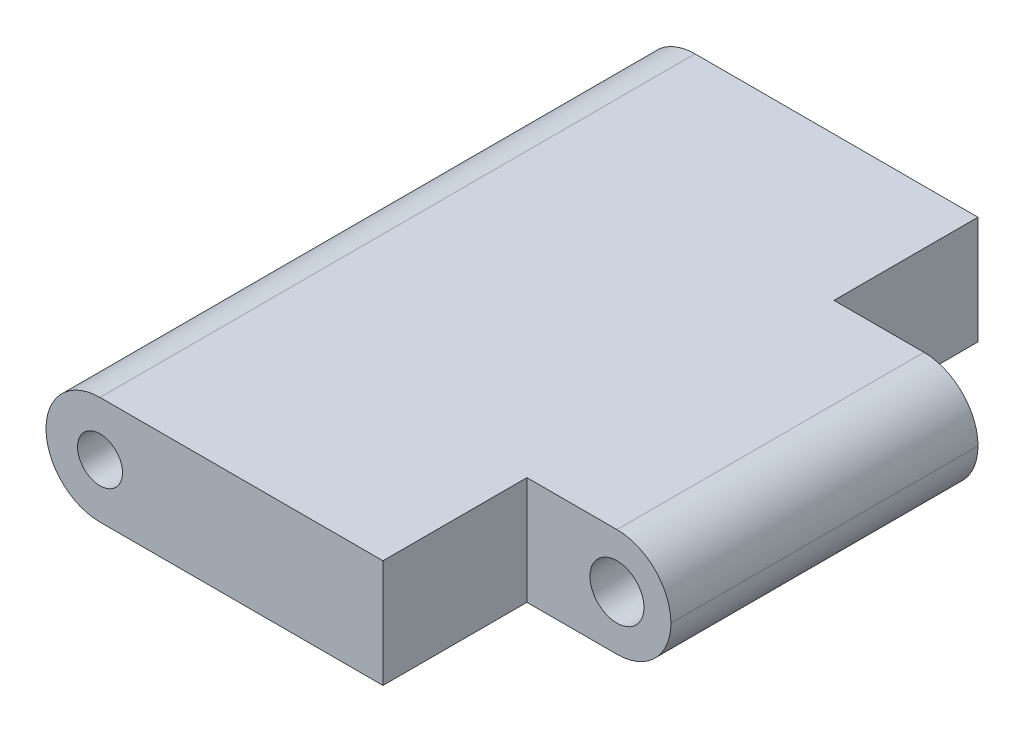
ISO-10303-21;
HEADER;
FILE_DESCRIPTION(('STEP AP214'),'2;1');
FILE_NAME('part.step','',(''),(''),'','','');
FILE_SCHEMA(('AUTOMOTIVE_DESIGN { 1 0 10303 214 1 1 1 1 }'));
ENDSEC;
DATA;
#1=APPLICATION_CONTEXT('core data for automotive mechanical design processes');
#2=APPLICATION_PROTOCOL_DEFINITION('international standard','automotive_design',2000,#1);
#3=PRODUCT_CONTEXT('',#1,'mechanical');
#4=PRODUCT('Part','Part','',(#3));
#5=PRODUCT_RELATED_PRODUCT_CATEGORY('part','',(#4));
#6=PRODUCT_DEFINITION_FORMATION('','',#4);
#7=PRODUCT_DEFINITION_CONTEXT('part definition',#1,'design');
#8=PRODUCT_DEFINITION('design','',#6,#7);
#9=PRODUCT_DEFINITION_SHAPE('','',#8);
#10=(LENGTH_UNIT() NAMED_UNIT(*) SI_UNIT(.MILLI.,.METRE.));
#11=(NAMED_UNIT(*) PLANE_ANGLE_UNIT() SI_UNIT($,.RADIAN.));
#12=(NAMED_UNIT(*) SI_UNIT($,.STERADIAN.) SOLID_ANGLE_UNIT());
#13=UNCERTAINTY_MEASURE_WITH_UNIT(LENGTH_MEASURE(1.E-05),#10,'distance_accuracy_value','');
#14=(GEOMETRIC_REPRESENTATION_CONTEXT(3) GLOBAL_UNCERTAINTY_ASSIGNED_CONTEXT((#13)) GLOBAL_UNIT_ASSIGNED_CONTEXT((#10,
#11,#12)) REPRESENTATION_CONTEXT('',''));
#15=CARTESIAN_POINT('',(0.,0.,0.));
#16=DIRECTION('',(0.,0.,1.));
#17=DIRECTION('',(1.,0.,0.));
#18=AXIS2_PLACEMENT_3D('',#15,#16,#17);
#19=CARTESIAN_POINT('',(15.5838095287745,3.45,2.47935041886915));
#20=DIRECTION('',(0.,0.,-1.));
#21=DIRECTION('',(-1.,0.,0.));
#22=AXIS2_PLACEMENT_3D('',#19,#20,#21);
#23=PLANE('',#22);
#24=CARTESIAN_POINT('',(0.16703536190109,1.5,2.47935041886915));
#25=DIRECTION('',(0.,0.,1.));
#26=DIRECTION('',(1.,0.,0.));
#27=AXIS2_PLACEMENT_3D('',#24,#25,#26);
#28=CIRCLE('',#27,0.8125);
#29=CARTESIAN_POINT('',(0.97953536190109,1.5,2.47935041886915));
#30=VERTEX_POINT('',#29);
#31=EDGE_CURVE('E210',#30,#30,#28,.T.);
#32=ORIENTED_EDGE('',*,*,#31,.F.);
#33=EDGE_LOOP('',(#32));
#34=FACE_BOUND('',#33,.T.);
#35=CARTESIAN_POINT('',(0.167035361901083,1.5,2.47935041886915));
#36=DIRECTION('',(0.,0.,-1.));
#37=DIRECTION('',(-1.,0.,0.));
#38=AXIS2_PLACEMENT_3D('',#35,#36,#37);
#39=CIRCLE('',#38,1.95);
#40=CARTESIAN_POINT('',(0.167035361901083,3.45,2.47935041886915));
#41=VERTEX_POINT('',#40);
#42=CARTESIAN_POINT('',(-1.78296463809892,1.5,2.47935041886915));
#43=VERTEX_POINT('',#42);
#44=EDGE_CURVE('E160',#41,#43,#39,.F.);
#45=ORIENTED_EDGE('',*,*,#44,.T.);
#46=CARTESIAN_POINT('',(0.167035361901083,1.5,2.47935041886915));
#47=DIRECTION('',(0.,0.,-1.));
#48=DIRECTION('',(-1.,0.,0.));
#49=AXIS2_PLACEMENT_3D('',#46,#47,#48);
#50=CIRCLE('',#49,1.95);
#51=CARTESIAN_POINT('',(0.167035361901083,-0.45,2.47935041886915));
#52=VERTEX_POINT('',#51);
#53=EDGE_CURVE('E163',#43,#52,#50,.F.);
#54=ORIENTED_EDGE('',*,*,#53,.T.);
#55=DIRECTION('',(1.,0.,0.));
#56=VECTOR('',#55,1.);
#57=CARTESIAN_POINT('',(15.5838095287745,-0.45,2.47935041886915));
#58=LINE('',#57,#56);
#59=CARTESIAN_POINT('',(10.3838095287745,-0.45,2.47935041886915));
#60=VERTEX_POINT('',#59);
#61=EDGE_CURVE('E152',#52,#60,#58,.T.);
#62=ORIENTED_EDGE('',*,*,#61,.T.);
#63=DIRECTION('',(0.,1.,0.));
#64=VECTOR('',#63,1.);
#65=CARTESIAN_POINT('',(10.3838095287745,-0.45,2.47935041886915));
#66=LINE('',#65,#64);
#67=CARTESIAN_POINT('',(10.3838095287745,3.45,2.47935041886915));
#68=VERTEX_POINT('',#67);
#69=EDGE_CURVE('E194',#60,#68,#66,.T.);
#70=ORIENTED_EDGE('',*,*,#69,.T.);
#71=DIRECTION('',(1.,0.,0.));
#72=VECTOR('',#71,1.);
#73=CARTESIAN_POINT('',(15.5838095287745,3.45,2.47935041886915));
#74=LINE('',#73,#72);
#75=EDGE_CURVE('E151',#41,#68,#74,.T.);
#76=ORIENTED_EDGE('',*,*,#75,.F.);
#77=EDGE_LOOP('',(#45,#54,#62,#70,#76));
#78=FACE_BOUND('',#77,.T.);
#79=ADVANCED_FACE('F43',(#34,#78),#23,.F.);
#80=CARTESIAN_POINT('',(-1.78296463809892,3.45,-19.0083532113301));
#81=DIRECTION('',(0.,0.,1.));
#82=DIRECTION('',(1.,0.,0.));
#83=AXIS2_PLACEMENT_3D('',#80,#81,#82);
#84=PLANE('',#83);
#85=CARTESIAN_POINT('',(0.16703536190109,1.5,-19.0083532113301));
#86=DIRECTION('',(0.,0.,1.));
#87=DIRECTION('',(1.,0.,0.));
#88=AXIS2_PLACEMENT_3D('',#85,#86,#87);
#89=CIRCLE('',#88,0.8125);
#90=CARTESIAN_POINT('',(0.97953536190109,1.5,-19.0083532113301));
#91=VERTEX_POINT('',#90);
#92=EDGE_CURVE('E208',#91,#91,#89,.T.);
#93=ORIENTED_EDGE('',*,*,#92,.T.);
#94=EDGE_LOOP('',(#93));
#95=FACE_BOUND('',#94,.T.);
#96=DIRECTION('',(-1.,0.,0.));
#97=VECTOR('',#96,1.);
#98=CARTESIAN_POINT('',(-1.78296463809892,-0.45,-19.0083532113301));
#99=LINE('',#98,#97);
#100=CARTESIAN_POINT('',(10.3838095287745,-0.45,-19.0083532113301));
#101=VERTEX_POINT('',#100);
#102=CARTESIAN_POINT('',(0.167035361901083,-0.45,-19.0083532113301));
#103=VERTEX_POINT('',#102);
#104=EDGE_CURVE('E140',#101,#103,#99,.T.);
#105=ORIENTED_EDGE('',*,*,#104,.T.);
#106=CARTESIAN_POINT('',(0.167035361901083,1.5,-19.0083532113301));
#107=DIRECTION('',(0.,0.,1.));
#108=DIRECTION('',(1.,0.,0.));
#109=AXIS2_PLACEMENT_3D('',#106,#107,#108);
#110=CIRCLE('',#109,1.95);
#111=CARTESIAN_POINT('',(-1.78296463809892,1.5,-19.0083532113301));
#112=VERTEX_POINT('',#111);
#113=EDGE_CURVE('E175',#103,#112,#110,.F.);
#114=ORIENTED_EDGE('',*,*,#113,.T.);
#115=CARTESIAN_POINT('',(0.167035361901083,1.5,-19.0083532113301));
#116=DIRECTION('',(0.,0.,1.));
#117=DIRECTION('',(1.,0.,0.));
#118=AXIS2_PLACEMENT_3D('',#115,#116,#117);
#119=CIRCLE('',#118,1.95);
#120=CARTESIAN_POINT('',(0.167035361901083,3.45,-19.0083532113301));
#121=VERTEX_POINT('',#120);
#122=EDGE_CURVE('E172',#112,#121,#119,.F.);
#123=ORIENTED_EDGE('',*,*,#122,.T.);
#124=DIRECTION('',(-1.,0.,0.));
#125=VECTOR('',#124,1.);
#126=CARTESIAN_POINT('',(-1.78296463809892,3.45,-19.0083532113301));
#127=LINE('',#126,#125);
#128=CARTESIAN_POINT('',(10.3838095287745,3.45,-19.0083532113301));
#129=VERTEX_POINT('',#128);
#130=EDGE_CURVE('E142',#129,#121,#127,.T.);
#131=ORIENTED_EDGE('',*,*,#130,.F.);
#132=DIRECTION('',(0.,1.,0.));
#133=VECTOR('',#132,1.);
#134=CARTESIAN_POINT('',(10.3838095287745,-0.45,-19.0083532113301));
#135=LINE('',#134,#133);
#136=EDGE_CURVE('E126',#101,#129,#135,.T.);
#137=ORIENTED_EDGE('',*,*,#136,.F.);
#138=EDGE_LOOP('',(#105,#114,#123,#131,#137));
#139=FACE_BOUND('',#138,.T.);
#140=ADVANCED_FACE('F139',(#95,#139),#84,.F.);
#141=CARTESIAN_POINT('',(-1.78296463809892,3.45,2.47935041886915));
#142=DIRECTION('',(0.,-1.,0.));
#143=DIRECTION('',(0.,0.,-1.));
#144=AXIS2_PLACEMENT_3D('',#141,#142,#143);
#145=PLANE('',#144);
#146=ORIENTED_EDGE('',*,*,#130,.T.);
#147=DIRECTION('',(0.,0.,1.));
#148=VECTOR('',#147,1.);
#149=CARTESIAN_POINT('',(0.167035361901083,3.45,2.47935041886915));
#150=LINE('',#149,#148);
#151=EDGE_CURVE('E181',#121,#41,#150,.T.);
#152=ORIENTED_EDGE('',*,*,#151,.T.);
#153=ORIENTED_EDGE('',*,*,#75,.T.);
#154=DIRECTION('',(0.,0.,1.));
#155=VECTOR('',#154,1.);
#156=CARTESIAN_POINT('',(10.3838095287745,3.45,-2.72064958113085));
#157=LINE('',#156,#155);
#158=CARTESIAN_POINT('',(10.3838095287745,3.45,-2.72064958113085));
#159=VERTEX_POINT('',#158);
#160=EDGE_CURVE('E231',#159,#68,#157,.T.);
#161=ORIENTED_EDGE('',*,*,#160,.F.);
#162=DIRECTION('',(-1.,0.,0.));
#163=VECTOR('',#162,1.);
#164=CARTESIAN_POINT('',(15.5838095287745,3.45,-2.72064958113085));
#165=LINE('',#164,#163);
#166=CARTESIAN_POINT('',(13.6338095287745,3.45,-2.72064958113085));
#167=VERTEX_POINT('',#166);
#168=EDGE_CURVE('E218',#167,#159,#165,.T.);
#169=ORIENTED_EDGE('',*,*,#168,.F.);
#170=DIRECTION('',(0.,0.,-1.));
#171=VECTOR('',#170,1.);
#172=CARTESIAN_POINT('',(13.6338095287745,3.45,2.47935041886915));
#173=LINE('',#172,#171);
#174=CARTESIAN_POINT('',(13.6338095287745,3.45,-13.8083532113301));
#175=VERTEX_POINT('',#174);
#176=EDGE_CURVE('E178',#167,#175,#173,.T.);
#177=ORIENTED_EDGE('',*,*,#176,.T.);
#178=DIRECTION('',(1.,0.,0.));
#179=VECTOR('',#178,1.);
#180=CARTESIAN_POINT('',(10.3838095287745,3.45,-13.8083532113301));
#181=LINE('',#180,#179);
#182=CARTESIAN_POINT('',(10.3838095287745,3.45,-13.8083532113301));
#183=VERTEX_POINT('',#182);
#184=EDGE_CURVE('E134',#183,#175,#181,.T.);
#185=ORIENTED_EDGE('',*,*,#184,.F.);
#186=DIRECTION('',(0.,0.,1.));
#187=VECTOR('',#186,1.);
#188=CARTESIAN_POINT('',(10.3838095287745,3.45,-19.0083532113301));
#189=LINE('',#188,#187);
#190=EDGE_CURVE('E215',#129,#183,#189,.T.);
#191=ORIENTED_EDGE('',*,*,#190,.F.);
#192=EDGE_LOOP('',(#146,#152,#153,#161,#169,#177,#185,#191));
#193=FACE_BOUND('',#192,.T.);
#194=ADVANCED_FACE('F245',(#193),#145,.F.);
#195=CARTESIAN_POINT('',(-1.78296463809892,-0.45,2.47935041886915));
#196=DIRECTION('',(0.,-1.,0.));
#197=DIRECTION('',(0.,0.,-1.));
#198=AXIS2_PLACEMENT_3D('',#195,#196,#197);
#199=PLANE('',#198);
#200=ORIENTED_EDGE('',*,*,#61,.F.);
#201=DIRECTION('',(0.,0.,1.));
#202=VECTOR('',#201,1.);
#203=CARTESIAN_POINT('',(0.167035361901083,-0.45,-19.0083532113301));
#204=LINE('',#203,#202);
#205=EDGE_CURVE('E149',#52,#103,#204,.F.);
#206=ORIENTED_EDGE('',*,*,#205,.T.);
#207=ORIENTED_EDGE('',*,*,#104,.F.);
#208=DIRECTION('',(0.,0.,1.));
#209=VECTOR('',#208,1.);
#210=CARTESIAN_POINT('',(10.3838095287745,-0.45,-19.0083532113301));
#211=LINE('',#210,#209);
#212=CARTESIAN_POINT('',(10.3838095287745,-0.45,-13.8083532113301));
#213=VERTEX_POINT('',#212);
#214=EDGE_CURVE('E122',#101,#213,#211,.T.);
#215=ORIENTED_EDGE('',*,*,#214,.T.);
#216=DIRECTION('',(1.,0.,0.));
#217=VECTOR('',#216,1.);
#218=CARTESIAN_POINT('',(10.3838095287745,-0.45,-13.8083532113301));
#219=LINE('',#218,#217);
#220=CARTESIAN_POINT('',(13.6338095287745,-0.45,-13.8083532113301));
#221=VERTEX_POINT('',#220);
#222=EDGE_CURVE('E133',#213,#221,#219,.T.);
#223=ORIENTED_EDGE('',*,*,#222,.T.);
#224=DIRECTION('',(0.,0.,-1.));
#225=VECTOR('',#224,1.);
#226=CARTESIAN_POINT('',(13.6338095287745,-0.45,-2.72064958113085));
#227=LINE('',#226,#225);
#228=CARTESIAN_POINT('',(13.6338095287745,-0.45,-2.72064958113085));
#229=VERTEX_POINT('',#228);
#230=EDGE_CURVE('E166',#221,#229,#227,.F.);
#231=ORIENTED_EDGE('',*,*,#230,.T.);
#232=DIRECTION('',(-1.,0.,0.));
#233=VECTOR('',#232,1.);
#234=CARTESIAN_POINT('',(15.5838095287745,-0.45,-2.72064958113085));
#235=LINE('',#234,#233);
#236=CARTESIAN_POINT('',(10.3838095287745,-0.45,-2.72064958113085));
#237=VERTEX_POINT('',#236);
#238=EDGE_CURVE('E235',#229,#237,#235,.T.);
#239=ORIENTED_EDGE('',*,*,#238,.T.);
#240=DIRECTION('',(0.,0.,1.));
#241=VECTOR('',#240,1.);
#242=CARTESIAN_POINT('',(10.3838095287745,-0.45,-2.72064958113085));
#243=LINE('',#242,#241);
#244=EDGE_CURVE('E227',#237,#60,#243,.T.);
#245=ORIENTED_EDGE('',*,*,#244,.T.);
#246=EDGE_LOOP('',(#200,#206,#207,#215,#223,#231,#239,#245));
#247=FACE_BOUND('',#246,.T.);
#248=ADVANCED_FACE('F147',(#247),#199,.T.);
#249=CARTESIAN_POINT('',(10.3838095287745,-0.45,-2.72064958113085));
#250=DIRECTION('',(-1.,0.,0.));
#251=DIRECTION('',(0.,0.,1.));
#252=AXIS2_PLACEMENT_3D('',#249,#250,#251);
#253=PLANE('',#252);
#254=ORIENTED_EDGE('',*,*,#160,.T.);
#255=ORIENTED_EDGE('',*,*,#69,.F.);
#256=ORIENTED_EDGE('',*,*,#244,.F.);
#257=DIRECTION('',(0.,1.,0.));
#258=VECTOR('',#257,1.);
#259=CARTESIAN_POINT('',(10.3838095287745,-0.45,-2.72064958113085));
#260=LINE('',#259,#258);
#261=EDGE_CURVE('E223',#237,#159,#260,.T.);
#262=ORIENTED_EDGE('',*,*,#261,.T.);
#263=EDGE_LOOP('',(#254,#255,#256,#262));
#264=FACE_BOUND('',#263,.T.);
#265=ADVANCED_FACE('F259',(#264),#253,.F.);
#266=CARTESIAN_POINT('',(15.5838095287745,-0.45,-2.72064958113085));
#267=DIRECTION('',(0.,0.,-1.));
#268=DIRECTION('',(-1.,0.,0.));
#269=AXIS2_PLACEMENT_3D('',#266,#267,#268);
#270=PLANE('',#269);
#271=CARTESIAN_POINT('',(13.6338095287745,1.5,-2.72064958113085));
#272=DIRECTION('',(0.,0.,-1.));
#273=DIRECTION('',(-1.,0.,0.));
#274=AXIS2_PLACEMENT_3D('',#271,#272,#273);
#275=CIRCLE('',#274,0.975000000000001);
#276=CARTESIAN_POINT('',(12.6588095287745,1.5,-2.72064958113085));
#277=VERTEX_POINT('',#276);
#278=EDGE_CURVE('E198',#277,#277,#275,.T.);
#279=ORIENTED_EDGE('',*,*,#278,.T.);
#280=EDGE_LOOP('',(#279));
#281=FACE_BOUND('',#280,.T.);
#282=ORIENTED_EDGE('',*,*,#238,.F.);
#283=CARTESIAN_POINT('',(13.6338095287745,1.5,-2.72064958113085));
#284=DIRECTION('',(0.,0.,-1.));
#285=DIRECTION('',(-1.,0.,0.));
#286=AXIS2_PLACEMENT_3D('',#283,#284,#285);
#287=CIRCLE('',#286,1.95);
#288=CARTESIAN_POINT('',(15.5838095287745,1.5,-2.72064958113085));
#289=VERTEX_POINT('',#288);
#290=EDGE_CURVE('E11',#229,#289,#287,.F.);
#291=ORIENTED_EDGE('',*,*,#290,.T.);
#292=CARTESIAN_POINT('',(13.6338095287745,1.5,-2.72064958113085));
#293=DIRECTION('',(0.,0.,-1.));
#294=DIRECTION('',(-1.,0.,0.));
#295=AXIS2_PLACEMENT_3D('',#292,#293,#294);
#296=CIRCLE('',#295,1.95);
#297=EDGE_CURVE('E53',#289,#167,#296,.F.);
#298=ORIENTED_EDGE('',*,*,#297,.T.);
#299=ORIENTED_EDGE('',*,*,#168,.T.);
#300=ORIENTED_EDGE('',*,*,#261,.F.);
#301=EDGE_LOOP('',(#282,#291,#298,#299,#300));
#302=FACE_BOUND('',#301,.T.);
#303=ADVANCED_FACE('F262',(#281,#302),#270,.F.);
#304=CARTESIAN_POINT('',(10.3838095287745,-0.45,-13.8083532113301));
#305=DIRECTION('',(0.,0.,1.));
#306=DIRECTION('',(1.,0.,0.));
#307=AXIS2_PLACEMENT_3D('',#304,#305,#306);
#308=PLANE('',#307);
#309=CARTESIAN_POINT('',(13.6338095287745,1.5,-13.8083532113301));
#310=DIRECTION('',(0.,0.,1.));
#311=DIRECTION('',(1.,0.,0.));
#312=AXIS2_PLACEMENT_3D('',#309,#310,#311);
#313=CIRCLE('',#312,0.975000000000001);
#314=CARTESIAN_POINT('',(14.6088095287745,1.5,-13.8083532113301));
#315=VERTEX_POINT('',#314);
#316=EDGE_CURVE('E47',#315,#315,#313,.T.);
#317=ORIENTED_EDGE('',*,*,#316,.T.);
#318=EDGE_LOOP('',(#317));
#319=FACE_BOUND('',#318,.T.);
#320=CARTESIAN_POINT('',(13.6338095287745,1.5,-13.8083532113301));
#321=DIRECTION('',(0.,0.,1.));
#322=DIRECTION('',(1.,0.,0.));
#323=AXIS2_PLACEMENT_3D('',#320,#321,#322);
#324=CIRCLE('',#323,1.95);
#325=CARTESIAN_POINT('',(15.5838095287745,1.5,-13.8083532113301));
#326=VERTEX_POINT('',#325);
#327=EDGE_CURVE('E67',#175,#326,#324,.F.);
#328=ORIENTED_EDGE('',*,*,#327,.T.);
#329=CARTESIAN_POINT('',(13.6338095287745,1.5,-13.8083532113301));
#330=DIRECTION('',(0.,0.,1.));
#331=DIRECTION('',(1.,0.,0.));
#332=AXIS2_PLACEMENT_3D('',#329,#330,#331);
#333=CIRCLE('',#332,1.95);
#334=EDGE_CURVE('E186',#326,#221,#333,.F.);
#335=ORIENTED_EDGE('',*,*,#334,.T.);
#336=ORIENTED_EDGE('',*,*,#222,.F.);
#337=DIRECTION('',(0.,1.,0.));
#338=VECTOR('',#337,1.);
#339=CARTESIAN_POINT('',(10.3838095287745,-0.45,-13.8083532113301));
#340=LINE('',#339,#338);
#341=EDGE_CURVE('E128',#213,#183,#340,.T.);
#342=ORIENTED_EDGE('',*,*,#341,.T.);
#343=ORIENTED_EDGE('',*,*,#184,.T.);
#344=EDGE_LOOP('',(#328,#335,#336,#342,#343));
#345=FACE_BOUND('',#344,.T.);
#346=ADVANCED_FACE('F267',(#319,#345),#308,.F.);
#347=CARTESIAN_POINT('',(10.3838095287745,-0.45,-19.0083532113301));
#348=DIRECTION('',(-1.,0.,0.));
#349=DIRECTION('',(0.,0.,1.));
#350=AXIS2_PLACEMENT_3D('',#347,#348,#349);
#351=PLANE('',#350);
#352=ORIENTED_EDGE('',*,*,#190,.T.);
#353=ORIENTED_EDGE('',*,*,#341,.F.);
#354=ORIENTED_EDGE('',*,*,#214,.F.);
#355=ORIENTED_EDGE('',*,*,#136,.T.);
#356=EDGE_LOOP('',(#352,#353,#354,#355));
#357=FACE_BOUND('',#356,.T.);
#358=ADVANCED_FACE('F125',(#357),#351,.F.);
#359=CARTESIAN_POINT('',(0.167035361901083,1.5,2.47935041886915));
#360=DIRECTION('',(0.,0.,1.));
#361=DIRECTION('',(1.,0.,0.));
#362=AXIS2_PLACEMENT_3D('',#359,#360,#361);
#363=CYLINDRICAL_SURFACE('',#362,1.95);
#364=ORIENTED_EDGE('',*,*,#151,.F.);
#365=ORIENTED_EDGE('',*,*,#122,.F.);
#366=DIRECTION('',(0.,0.,1.));
#367=VECTOR('',#366,1.);
#368=CARTESIAN_POINT('',(-1.78296463809892,1.5,2.47935041886915));
#369=LINE('',#368,#367);
#370=EDGE_CURVE('E191',#43,#112,#369,.F.);
#371=ORIENTED_EDGE('',*,*,#370,.F.);
#372=ORIENTED_EDGE('',*,*,#44,.F.);
#373=EDGE_LOOP('',(#364,#365,#371,#372));
#374=FACE_BOUND('',#373,.T.);
#375=ADVANCED_FACE('F251',(#374),#363,.T.);
#376=CARTESIAN_POINT('',(0.167035361901083,1.5,2.47935041886915));
#377=DIRECTION('',(0.,0.,-1.));
#378=DIRECTION('',(-1.,0.,0.));
#379=AXIS2_PLACEMENT_3D('',#376,#377,#378);
#380=CYLINDRICAL_SURFACE('',#379,1.95);
#381=ORIENTED_EDGE('',*,*,#113,.F.);
#382=ORIENTED_EDGE('',*,*,#205,.F.);
#383=ORIENTED_EDGE('',*,*,#53,.F.);
#384=ORIENTED_EDGE('',*,*,#370,.T.);
#385=EDGE_LOOP('',(#381,#382,#383,#384));
#386=FACE_BOUND('',#385,.T.);
#387=ADVANCED_FACE('F269',(#386),#380,.T.);
#388=CARTESIAN_POINT('',(13.6338095287745,1.5,2.47935041886915));
#389=DIRECTION('',(0.,0.,-1.));
#390=DIRECTION('',(-1.,0.,0.));
#391=AXIS2_PLACEMENT_3D('',#388,#389,#390);
#392=CYLINDRICAL_SURFACE('',#391,1.95);
#393=ORIENTED_EDGE('',*,*,#176,.F.);
#394=ORIENTED_EDGE('',*,*,#297,.F.);
#395=DIRECTION('',(0.,0.,-1.));
#396=VECTOR('',#395,1.);
#397=CARTESIAN_POINT('',(15.5838095287745,1.5,-19.0083532113301));
#398=LINE('',#397,#396);
#399=EDGE_CURVE('E195',#326,#289,#398,.F.);
#400=ORIENTED_EDGE('',*,*,#399,.F.);
#401=ORIENTED_EDGE('',*,*,#327,.F.);
#402=EDGE_LOOP('',(#393,#394,#400,#401));
#403=FACE_BOUND('',#402,.T.);
#404=ADVANCED_FACE('F45',(#403),#392,.T.);
#405=CARTESIAN_POINT('',(13.6338095287745,1.5,-19.0083532113301));
#406=DIRECTION('',(0.,0.,1.));
#407=DIRECTION('',(1.,0.,0.));
#408=AXIS2_PLACEMENT_3D('',#405,#406,#407);
#409=CYLINDRICAL_SURFACE('',#408,1.95);
#410=ORIENTED_EDGE('',*,*,#290,.F.);
#411=ORIENTED_EDGE('',*,*,#230,.F.);
#412=ORIENTED_EDGE('',*,*,#334,.F.);
#413=ORIENTED_EDGE('',*,*,#399,.T.);
#414=EDGE_LOOP('',(#410,#411,#412,#413));
#415=FACE_BOUND('',#414,.T.);
#416=ADVANCED_FACE('F266',(#415),#409,.T.);
#417=CARTESIAN_POINT('',(13.6338095287745,1.5,-19.0083532113301));
#418=DIRECTION('',(0.,0.,1.));
#419=DIRECTION('',(1.,0.,0.));
#420=AXIS2_PLACEMENT_3D('',#417,#418,#419);
#421=CYLINDRICAL_SURFACE('',#420,0.975000000000001);
#422=ORIENTED_EDGE('',*,*,#316,.F.);
#423=EDGE_LOOP('',(#422));
#424=FACE_BOUND('',#423,.T.);
#425=ORIENTED_EDGE('',*,*,#278,.F.);
#426=EDGE_LOOP('',(#425));
#427=FACE_BOUND('',#426,.T.);
#428=ADVANCED_FACE('F300',(#424,#427),#421,.F.);
#429=CARTESIAN_POINT('',(0.16703536190109,1.5,-19.0083532113301));
#430=DIRECTION('',(0.,0.,1.));
#431=DIRECTION('',(1.,0.,0.));
#432=AXIS2_PLACEMENT_3D('',#429,#430,#431);
#433=CYLINDRICAL_SURFACE('',#432,0.8125);
#434=ORIENTED_EDGE('',*,*,#92,.F.);
#435=EDGE_LOOP('',(#434));
#436=FACE_BOUND('',#435,.T.);
#437=ORIENTED_EDGE('',*,*,#31,.T.);
#438=EDGE_LOOP('',(#437));
#439=FACE_BOUND('',#438,.T.);
#440=ADVANCED_FACE('F303',(#436,#439),#433,.F.);
#441=CLOSED_SHELL('',(#79,#140,#194,#248,#265,#303,#346,#358,#375,#387,#404,#416,#428,#440));
#442=MANIFOLD_SOLID_BREP('B2',#441);
#443=ADVANCED_BREP_SHAPE_REPRESENTATION('',(#18,#442),#14);
#444=SHAPE_DEFINITION_REPRESENTATION(#9,#443);
ENDSEC;
END-ISO-10303-21;
